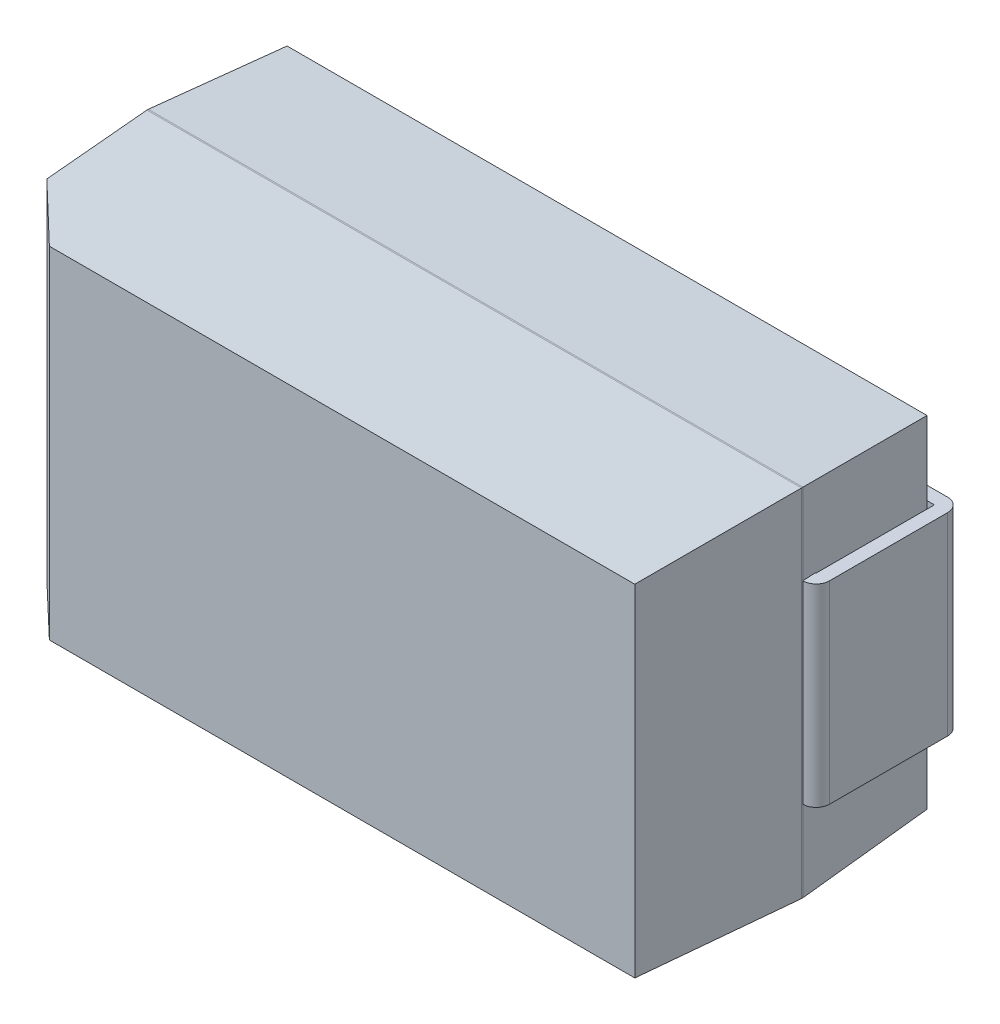
ISO-10303-21;
HEADER;
FILE_DESCRIPTION(('STEP AP214'),'2;1');
FILE_NAME('part.step','',(''),(''),'','','');
FILE_SCHEMA(('AUTOMOTIVE_DESIGN { 1 0 10303 214 1 1 1 1 }'));
ENDSEC;
DATA;
#1=APPLICATION_CONTEXT('core data for automotive mechanical design processes');
#2=APPLICATION_PROTOCOL_DEFINITION('international standard','automotive_design',2000,#1);
#3=PRODUCT_CONTEXT('',#1,'mechanical');
#4=PRODUCT('Part','Part','',(#3));
#5=PRODUCT_RELATED_PRODUCT_CATEGORY('part','',(#4));
#6=PRODUCT_DEFINITION_FORMATION('','',#4);
#7=PRODUCT_DEFINITION_CONTEXT('part definition',#1,'design');
#8=PRODUCT_DEFINITION('design','',#6,#7);
#9=PRODUCT_DEFINITION_SHAPE('','',#8);
#10=(LENGTH_UNIT() NAMED_UNIT(*) SI_UNIT(.MILLI.,.METRE.));
#11=(NAMED_UNIT(*) PLANE_ANGLE_UNIT() SI_UNIT($,.RADIAN.));
#12=(NAMED_UNIT(*) SI_UNIT($,.STERADIAN.) SOLID_ANGLE_UNIT());
#13=UNCERTAINTY_MEASURE_WITH_UNIT(LENGTH_MEASURE(1.E-05),#10,'distance_accuracy_value','');
#14=(GEOMETRIC_REPRESENTATION_CONTEXT(3) GLOBAL_UNCERTAINTY_ASSIGNED_CONTEXT((#13)) GLOBAL_UNIT_ASSIGNED_CONTEXT((#10,
#11,#12)) REPRESENTATION_CONTEXT('',''));
#15=CARTESIAN_POINT('',(0.,0.,0.));
#16=DIRECTION('',(0.,0.,1.));
#17=DIRECTION('',(1.,0.,0.));
#18=AXIS2_PLACEMENT_3D('',#15,#16,#17);
#19=CARTESIAN_POINT('',(-2.425125,-1.3325,1.69275));
#20=DIRECTION('',(0.998951225041669,0.,-0.045787006756815));
#21=DIRECTION('',(0.,1.,0.));
#22=AXIS2_PLACEMENT_3D('',#19,#20,#21);
#23=PLANE('',#22);
#24=DIRECTION('',(0.,1.,0.));
#25=VECTOR('',#24,1.);
#26=CARTESIAN_POINT('',(-2.416465439012,-1.27775,1.881678686764));
#27=LINE('',#26,#25);
#28=CARTESIAN_POINT('',(-2.416465439012,-1.296465439012,1.881678686764));
#29=VERTEX_POINT('',#28);
#30=CARTESIAN_POINT('',(-2.416465439012,1.296465439012,1.881678686764));
#31=VERTEX_POINT('',#30);
#32=EDGE_CURVE('P0_E11',#29,#31,#27,.T.);
#33=ORIENTED_EDGE('',*,*,#32,.T.);
#34=DIRECTION('',(0.045739087004806,-0.045739087004806,0.9979057429637));
#35=VECTOR('',#34,1.);
#36=CARTESIAN_POINT('',(-2.422394594868,1.302394594868,1.75232020878));
#37=LINE('',#36,#35);
#38=CARTESIAN_POINT('',(-2.4525,1.3325,1.0955));
#39=VERTEX_POINT('',#38);
#40=EDGE_CURVE('P0_E23',#39,#31,#37,.T.);
#41=ORIENTED_EDGE('',*,*,#40,.F.);
#42=DIRECTION('',(0.,1.,0.));
#43=VECTOR('',#42,1.);
#44=CARTESIAN_POINT('',(-2.4525,-1.3325,1.0955));
#45=LINE('',#44,#43);
#46=CARTESIAN_POINT('',(-2.4525,-1.3325,1.0955));
#47=VERTEX_POINT('',#46);
#48=EDGE_CURVE('P0_E170',#47,#39,#45,.T.);
#49=ORIENTED_EDGE('',*,*,#48,.F.);
#50=DIRECTION('',(0.045739087004806,0.045739087004806,0.9979057429637));
#51=VECTOR('',#50,1.);
#52=CARTESIAN_POINT('',(-2.425182270254,-1.305182270254,1.691500514728));
#53=LINE('',#52,#51);
#54=EDGE_CURVE('P0_E35',#47,#29,#53,.T.);
#55=ORIENTED_EDGE('',*,*,#54,.T.);
#56=EDGE_LOOP('',(#33,#41,#49,#55));
#57=FACE_BOUND('',#56,.T.);
#58=ADVANCED_FACE('P0_F16',(#57),#23,.F.);
#59=CARTESIAN_POINT('',(-2.4525,-1.305125,1.69275));
#60=DIRECTION('',(0.,0.998951225041669,-0.045787006756815));
#61=DIRECTION('',(-1.,0.,0.));
#62=AXIS2_PLACEMENT_3D('',#59,#60,#61);
#63=PLANE('',#62);
#64=ORIENTED_EDGE('',*,*,#54,.F.);
#65=DIRECTION('',(1.,0.,0.));
#66=VECTOR('',#65,1.);
#67=CARTESIAN_POINT('',(-2.4525,-1.3325,1.0955));
#68=LINE('',#67,#66);
#69=CARTESIAN_POINT('',(2.4525,-1.3325,1.0955));
#70=VERTEX_POINT('',#69);
#71=EDGE_CURVE('P0_E167',#47,#70,#68,.T.);
#72=ORIENTED_EDGE('',*,*,#71,.T.);
#73=DIRECTION('',(-0.045739087004806,0.045739087004806,0.9979057429637));
#74=VECTOR('',#73,1.);
#75=CARTESIAN_POINT('',(2.420051483098,-1.300051483098,1.803440702092));
#76=LINE('',#75,#74);
#77=CARTESIAN_POINT('',(2.39775,-1.27775,2.29));
#78=VERTEX_POINT('',#77);
#79=EDGE_CURVE('P0_E165',#70,#78,#76,.T.);
#80=ORIENTED_EDGE('',*,*,#79,.T.);
#81=DIRECTION('',(1.,0.,0.));
#82=VECTOR('',#81,1.);
#83=CARTESIAN_POINT('',(-2.4525,-1.27775,2.29));
#84=LINE('',#83,#82);
#85=CARTESIAN_POINT('',(-1.989,-1.27775,2.29));
#86=VERTEX_POINT('',#85);
#87=EDGE_CURVE('P0_E162',#86,#78,#84,.T.);
#88=ORIENTED_EDGE('',*,*,#87,.F.);
#89=DIRECTION('',(0.72275162794003,0.031643760591961,0.690383050723028));
#90=VECTOR('',#89,1.);
#91=CARTESIAN_POINT('',(-2.366138171404,-1.294261993256,1.929752037556));
#92=LINE('',#91,#90);
#93=EDGE_CURVE('P0_E159',#29,#86,#92,.T.);
#94=ORIENTED_EDGE('',*,*,#93,.F.);
#95=EDGE_LOOP('',(#64,#72,#80,#88,#94));
#96=FACE_BOUND('',#95,.T.);
#97=ADVANCED_FACE('P0_F206',(#96),#63,.F.);
#98=CARTESIAN_POINT('',(-2.202732719506,-1.27775,2.085839343382));
#99=DIRECTION('',(0.690728960317711,0.,-0.723113755489698));
#100=DIRECTION('',(0.,1.,0.));
#101=AXIS2_PLACEMENT_3D('',#98,#99,#100);
#102=PLANE('',#101);
#103=DIRECTION('',(0.,1.,0.));
#104=VECTOR('',#103,1.);
#105=CARTESIAN_POINT('',(-1.989,-1.27775,2.29));
#106=LINE('',#105,#104);
#107=CARTESIAN_POINT('',(-1.989,1.27775,2.29));
#108=VERTEX_POINT('',#107);
#109=EDGE_CURVE('P0_E156',#86,#108,#106,.T.);
#110=ORIENTED_EDGE('',*,*,#109,.T.);
#111=DIRECTION('',(0.72275162794003,-0.031643760591961,0.690383050723028));
#112=VECTOR('',#111,1.);
#113=CARTESIAN_POINT('',(-2.336915288471,1.292982546935,1.957666167792));
#114=LINE('',#113,#112);
#115=EDGE_CURVE('P0_E154',#31,#108,#114,.T.);
#116=ORIENTED_EDGE('',*,*,#115,.F.);
#117=ORIENTED_EDGE('',*,*,#32,.F.);
#118=ORIENTED_EDGE('',*,*,#93,.T.);
#119=EDGE_LOOP('',(#110,#116,#117,#118));
#120=FACE_BOUND('',#119,.T.);
#121=ADVANCED_FACE('P0_F210',(#120),#102,.F.);
#122=CARTESIAN_POINT('',(-2.4525,-1.3325,0.1));
#123=DIRECTION('',(1.,0.,0.));
#124=DIRECTION('',(0.,0.,1.));
#125=AXIS2_PLACEMENT_3D('',#122,#123,#124);
#126=PLANE('',#125);
#127=ORIENTED_EDGE('',*,*,#48,.T.);
#128=DIRECTION('',(0.,0.,1.));
#129=VECTOR('',#128,1.);
#130=CARTESIAN_POINT('',(-2.4525,1.3325,0.1));
#131=LINE('',#130,#129);
#132=CARTESIAN_POINT('',(-2.4525,1.3325,1.0855));
#133=VERTEX_POINT('',#132);
#134=EDGE_CURVE('P0_E151',#133,#39,#131,.T.);
#135=ORIENTED_EDGE('',*,*,#134,.F.);
#136=DIRECTION('',(0.,1.,0.));
#137=VECTOR('',#136,1.);
#138=CARTESIAN_POINT('',(-2.4525,-1.3325,1.0855));
#139=LINE('',#138,#137);
#140=CARTESIAN_POINT('',(-2.4525,-1.3325,1.0855));
#141=VERTEX_POINT('',#140);
#142=EDGE_CURVE('P0_E149',#141,#133,#139,.T.);
#143=ORIENTED_EDGE('',*,*,#142,.F.);
#144=DIRECTION('',(0.,0.,1.));
#145=VECTOR('',#144,1.);
#146=CARTESIAN_POINT('',(-2.4525,-1.3325,0.1));
#147=LINE('',#146,#145);
#148=EDGE_CURVE('P0_E146',#141,#47,#147,.T.);
#149=ORIENTED_EDGE('',*,*,#148,.T.);
#150=EDGE_LOOP('',(#127,#135,#143,#149));
#151=FACE_BOUND('',#150,.T.);
#152=ADVANCED_FACE('P0_F173',(#151),#126,.F.);
#153=CARTESIAN_POINT('',(-2.4525,1.305125,1.69275));
#154=DIRECTION('',(0.,0.998951225041669,0.045787006756815));
#155=DIRECTION('',(-1.,0.,0.));
#156=AXIS2_PLACEMENT_3D('',#153,#154,#155);
#157=PLANE('',#156);
#158=ORIENTED_EDGE('',*,*,#115,.T.);
#159=DIRECTION('',(1.,0.,0.));
#160=VECTOR('',#159,1.);
#161=CARTESIAN_POINT('',(-2.4525,1.27775,2.29));
#162=LINE('',#161,#160);
#163=CARTESIAN_POINT('',(2.39775,1.27775,2.29));
#164=VERTEX_POINT('',#163);
#165=EDGE_CURVE('P0_E143',#108,#164,#162,.T.);
#166=ORIENTED_EDGE('',*,*,#165,.T.);
#167=DIRECTION('',(-0.045739087004806,-0.045739087004806,0.9979057429637));
#168=VECTOR('',#167,1.);
#169=CARTESIAN_POINT('',(2.417263807711,1.297263807711,1.864260396144));
#170=LINE('',#169,#168);
#171=CARTESIAN_POINT('',(2.4525,1.3325,1.0955));
#172=VERTEX_POINT('',#171);
#173=EDGE_CURVE('P0_E141',#172,#164,#170,.T.);
#174=ORIENTED_EDGE('',*,*,#173,.F.);
#175=DIRECTION('',(1.,0.,0.));
#176=VECTOR('',#175,1.);
#177=CARTESIAN_POINT('',(-2.4525,1.3325,1.0955));
#178=LINE('',#177,#176);
#179=EDGE_CURVE('P0_E139',#39,#172,#178,.T.);
#180=ORIENTED_EDGE('',*,*,#179,.F.);
#181=ORIENTED_EDGE('',*,*,#40,.T.);
#182=EDGE_LOOP('',(#158,#166,#174,#180,#181));
#183=FACE_BOUND('',#182,.T.);
#184=ADVANCED_FACE('P0_F180',(#183),#157,.T.);
#185=CARTESIAN_POINT('',(-2.4525,-1.3325,0.1));
#186=DIRECTION('',(0.,1.,0.));
#187=DIRECTION('',(0.,0.,1.));
#188=AXIS2_PLACEMENT_3D('',#185,#186,#187);
#189=PLANE('',#188);
#190=ORIENTED_EDGE('',*,*,#71,.F.);
#191=ORIENTED_EDGE('',*,*,#148,.F.);
#192=DIRECTION('',(1.,0.,0.));
#193=VECTOR('',#192,1.);
#194=CARTESIAN_POINT('',(-2.4525,-1.3325,1.0855));
#195=LINE('',#194,#193);
#196=CARTESIAN_POINT('',(2.4525,-1.3325,1.0855));
#197=VERTEX_POINT('',#196);
#198=EDGE_CURVE('P0_E136',#141,#197,#195,.T.);
#199=ORIENTED_EDGE('',*,*,#198,.T.);
#200=DIRECTION('',(0.,0.,1.));
#201=VECTOR('',#200,1.);
#202=CARTESIAN_POINT('',(2.4525,-1.3325,0.1));
#203=LINE('',#202,#201);
#204=EDGE_CURVE('P0_E133',#197,#70,#203,.T.);
#205=ORIENTED_EDGE('',*,*,#204,.T.);
#206=EDGE_LOOP('',(#190,#191,#199,#205));
#207=FACE_BOUND('',#206,.T.);
#208=ADVANCED_FACE('P0_F222',(#207),#189,.F.);
#209=CARTESIAN_POINT('',(-2.4525,-1.3325,2.29));
#210=DIRECTION('',(0.,0.,1.));
#211=DIRECTION('',(1.,0.,0.));
#212=AXIS2_PLACEMENT_3D('',#209,#210,#211);
#213=PLANE('',#212);
#214=ORIENTED_EDGE('',*,*,#87,.T.);
#215=DIRECTION('',(0.,1.,0.));
#216=VECTOR('',#215,1.);
#217=CARTESIAN_POINT('',(2.39775,-1.3325,2.29));
#218=LINE('',#217,#216);
#219=EDGE_CURVE('P0_E130',#78,#164,#218,.T.);
#220=ORIENTED_EDGE('',*,*,#219,.T.);
#221=ORIENTED_EDGE('',*,*,#165,.F.);
#222=ORIENTED_EDGE('',*,*,#109,.F.);
#223=EDGE_LOOP('',(#214,#220,#221,#222));
#224=FACE_BOUND('',#223,.T.);
#225=ADVANCED_FACE('P0_F203',(#224),#213,.T.);
#226=CARTESIAN_POINT('',(2.425125,-1.3325,1.69275));
#227=DIRECTION('',(0.998951225041669,0.,0.045787006756815));
#228=DIRECTION('',(0.,1.,0.));
#229=AXIS2_PLACEMENT_3D('',#226,#227,#228);
#230=PLANE('',#229);
#231=ORIENTED_EDGE('',*,*,#79,.F.);
#232=DIRECTION('',(0.,1.,0.));
#233=VECTOR('',#232,1.);
#234=CARTESIAN_POINT('',(2.4525,-1.3325,1.0955));
#235=LINE('',#234,#233);
#236=EDGE_CURVE('P0_E127',#70,#172,#235,.T.);
#237=ORIENTED_EDGE('',*,*,#236,.T.);
#238=ORIENTED_EDGE('',*,*,#173,.T.);
#239=ORIENTED_EDGE('',*,*,#219,.F.);
#240=EDGE_LOOP('',(#231,#237,#238,#239));
#241=FACE_BOUND('',#240,.T.);
#242=ADVANCED_FACE('P0_F186',(#241),#230,.T.);
#243=CARTESIAN_POINT('',(-2.425125,-1.3325,0.59275));
#244=DIRECTION('',(-0.998460353205411,0.,-0.055470019622543));
#245=DIRECTION('',(0.,1.,0.));
#246=AXIS2_PLACEMENT_3D('',#243,#244,#245);
#247=PLANE('',#246);
#248=DIRECTION('',(0.055384877562174,0.055384877562174,-0.99692779611908));
#249=VECTOR('',#248,1.);
#250=CARTESIAN_POINT('',(-2.425208972393,-1.305208972393,0.594261503067));
#251=LINE('',#250,#249);
#252=CARTESIAN_POINT('',(-2.39775,-1.27775,0.1));
#253=VERTEX_POINT('',#252);
#254=EDGE_CURVE('P0_E125',#141,#253,#251,.T.);
#255=ORIENTED_EDGE('',*,*,#254,.F.);
#256=ORIENTED_EDGE('',*,*,#142,.T.);
#257=DIRECTION('',(0.055384877562174,-0.055384877562174,-0.99692779611908));
#258=VECTOR('',#257,1.);
#259=CARTESIAN_POINT('',(-2.42112154908,1.30112154908,0.520687883436));
#260=LINE('',#259,#258);
#261=CARTESIAN_POINT('',(-2.39775,1.27775,0.1));
#262=VERTEX_POINT('',#261);
#263=EDGE_CURVE('P0_E123',#133,#262,#260,.T.);
#264=ORIENTED_EDGE('',*,*,#263,.T.);
#265=DIRECTION('',(0.,1.,0.));
#266=VECTOR('',#265,1.);
#267=CARTESIAN_POINT('',(-2.39775,-1.3325,0.1));
#268=LINE('',#267,#266);
#269=EDGE_CURVE('P0_E102',#253,#262,#268,.T.);
#270=ORIENTED_EDGE('',*,*,#269,.F.);
#271=EDGE_LOOP('',(#255,#256,#264,#270));
#272=FACE_BOUND('',#271,.T.);
#273=ADVANCED_FACE('P0_F194',(#272),#247,.T.);
#274=CARTESIAN_POINT('',(-2.4525,1.3325,0.1));
#275=DIRECTION('',(0.,1.,0.));
#276=DIRECTION('',(0.,0.,1.));
#277=AXIS2_PLACEMENT_3D('',#274,#275,#276);
#278=PLANE('',#277);
#279=DIRECTION('',(0.,0.,1.));
#280=VECTOR('',#279,1.);
#281=CARTESIAN_POINT('',(2.4525,1.3325,0.1));
#282=LINE('',#281,#280);
#283=CARTESIAN_POINT('',(2.4525,1.3325,1.0855));
#284=VERTEX_POINT('',#283);
#285=EDGE_CURVE('P0_E119',#284,#172,#282,.T.);
#286=ORIENTED_EDGE('',*,*,#285,.F.);
#287=DIRECTION('',(1.,0.,0.));
#288=VECTOR('',#287,1.);
#289=CARTESIAN_POINT('',(-2.4525,1.3325,1.0855));
#290=LINE('',#289,#288);
#291=EDGE_CURVE('P0_E109',#133,#284,#290,.T.);
#292=ORIENTED_EDGE('',*,*,#291,.F.);
#293=ORIENTED_EDGE('',*,*,#134,.T.);
#294=ORIENTED_EDGE('',*,*,#179,.T.);
#295=EDGE_LOOP('',(#286,#292,#293,#294));
#296=FACE_BOUND('',#295,.T.);
#297=ADVANCED_FACE('P0_F178',(#296),#278,.T.);
#298=CARTESIAN_POINT('',(2.4525,-1.3325,0.1));
#299=DIRECTION('',(1.,0.,0.));
#300=DIRECTION('',(0.,0.,1.));
#301=AXIS2_PLACEMENT_3D('',#298,#299,#300);
#302=PLANE('',#301);
#303=ORIENTED_EDGE('',*,*,#204,.F.);
#304=DIRECTION('',(0.,1.,0.));
#305=VECTOR('',#304,1.);
#306=CARTESIAN_POINT('',(2.4525,-1.3325,1.0855));
#307=LINE('',#306,#305);
#308=EDGE_CURVE('P0_E116',#197,#284,#307,.T.);
#309=ORIENTED_EDGE('',*,*,#308,.T.);
#310=ORIENTED_EDGE('',*,*,#285,.T.);
#311=ORIENTED_EDGE('',*,*,#236,.F.);
#312=EDGE_LOOP('',(#303,#309,#310,#311));
#313=FACE_BOUND('',#312,.T.);
#314=ADVANCED_FACE('P0_F188',(#313),#302,.T.);
#315=CARTESIAN_POINT('',(-2.4525,-1.305125,0.59275));
#316=DIRECTION('',(0.,-0.998460353205411,-0.055470019622543));
#317=DIRECTION('',(-1.,0.,0.));
#318=AXIS2_PLACEMENT_3D('',#315,#316,#317);
#319=PLANE('',#318);
#320=DIRECTION('',(1.,0.,0.));
#321=VECTOR('',#320,1.);
#322=CARTESIAN_POINT('',(-2.4525,-1.27775,0.1));
#323=LINE('',#322,#321);
#324=CARTESIAN_POINT('',(2.39775,-1.27775,0.1));
#325=VERTEX_POINT('',#324);
#326=EDGE_CURVE('P0_E114',#253,#325,#323,.T.);
#327=ORIENTED_EDGE('',*,*,#326,.T.);
#328=DIRECTION('',(-0.055384877562174,0.055384877562174,-0.99692779611908));
#329=VECTOR('',#328,1.);
#330=CARTESIAN_POINT('',(2.417685966258,-1.297685966258,0.458847392638));
#331=LINE('',#330,#329);
#332=EDGE_CURVE('P0_E92',#197,#325,#331,.T.);
#333=ORIENTED_EDGE('',*,*,#332,.F.);
#334=ORIENTED_EDGE('',*,*,#198,.F.);
#335=ORIENTED_EDGE('',*,*,#254,.T.);
#336=EDGE_LOOP('',(#327,#333,#334,#335));
#337=FACE_BOUND('',#336,.T.);
#338=ADVANCED_FACE('P0_F191',(#337),#319,.T.);
#339=CARTESIAN_POINT('',(-2.4525,-1.3325,0.1));
#340=DIRECTION('',(0.,0.,1.));
#341=DIRECTION('',(1.,0.,0.));
#342=AXIS2_PLACEMENT_3D('',#339,#340,#341);
#343=PLANE('',#342);
#344=DIRECTION('',(1.,0.,0.));
#345=VECTOR('',#344,1.);
#346=CARTESIAN_POINT('',(-2.4525,1.27775,0.1));
#347=LINE('',#346,#345);
#348=CARTESIAN_POINT('',(2.39775,1.27775,0.1));
#349=VERTEX_POINT('',#348);
#350=EDGE_CURVE('P0_E96',#262,#349,#347,.T.);
#351=ORIENTED_EDGE('',*,*,#350,.T.);
#352=DIRECTION('',(0.,1.,0.));
#353=VECTOR('',#352,1.);
#354=CARTESIAN_POINT('',(2.39775,-1.3325,0.1));
#355=LINE('',#354,#353);
#356=EDGE_CURVE('P0_E85',#325,#349,#355,.T.);
#357=ORIENTED_EDGE('',*,*,#356,.F.);
#358=ORIENTED_EDGE('',*,*,#326,.F.);
#359=ORIENTED_EDGE('',*,*,#269,.T.);
#360=EDGE_LOOP('',(#351,#357,#358,#359));
#361=FACE_BOUND('',#360,.T.);
#362=ADVANCED_FACE('P0_F100',(#361),#343,.F.);
#363=CARTESIAN_POINT('',(-2.4525,1.305125,0.59275));
#364=DIRECTION('',(0.,-0.998460353205411,0.055470019622543));
#365=DIRECTION('',(-1.,0.,0.));
#366=AXIS2_PLACEMENT_3D('',#363,#364,#365);
#367=PLANE('',#366);
#368=ORIENTED_EDGE('',*,*,#263,.F.);
#369=ORIENTED_EDGE('',*,*,#291,.T.);
#370=DIRECTION('',(-0.055384877562174,-0.055384877562174,-0.99692779611908));
#371=VECTOR('',#370,1.);
#372=CARTESIAN_POINT('',(2.413598542945,1.293598542945,0.385273773006));
#373=LINE('',#372,#371);
#374=EDGE_CURVE('P0_E90',#284,#349,#373,.T.);
#375=ORIENTED_EDGE('',*,*,#374,.T.);
#376=ORIENTED_EDGE('',*,*,#350,.F.);
#377=EDGE_LOOP('',(#368,#369,#375,#376));
#378=FACE_BOUND('',#377,.T.);
#379=ADVANCED_FACE('P0_F107',(#378),#367,.F.);
#380=CARTESIAN_POINT('',(2.425125,-1.3325,0.59275));
#381=DIRECTION('',(-0.998460353205411,0.,0.055470019622543));
#382=DIRECTION('',(0.,1.,0.));
#383=AXIS2_PLACEMENT_3D('',#380,#381,#382);
#384=PLANE('',#383);
#385=ORIENTED_EDGE('',*,*,#356,.T.);
#386=ORIENTED_EDGE('',*,*,#374,.F.);
#387=ORIENTED_EDGE('',*,*,#308,.F.);
#388=ORIENTED_EDGE('',*,*,#332,.T.);
#389=EDGE_LOOP('',(#385,#386,#387,#388));
#390=FACE_BOUND('',#389,.T.);
#391=ADVANCED_FACE('P0_F87',(#390),#384,.F.);
#392=CLOSED_SHELL('',(#58,#97,#121,#152,#184,#208,#225,#242,#273,#297,#314,#338,#362,#379,#391));
#393=MANIFOLD_SOLID_BREP('P0_B1',#392);
#394=CARTESIAN_POINT('',(-2.129541541621,-0.724999999999999,0.527183738746));
#395=DIRECTION('',(0.,-1.,0.));
#396=DIRECTION('',(0.,0.,-1.));
#397=AXIS2_PLACEMENT_3D('',#394,#395,#396);
#398=PLANE('',#397);
#399=DIRECTION('',(1.,0.,0.));
#400=VECTOR('',#399,1.);
#401=CARTESIAN_POINT('',(-2.5525,-0.724999999999999,1.0855));
#402=LINE('',#401,#400);
#403=CARTESIAN_POINT('',(-2.4525,-0.724999999999999,1.0855));
#404=VERTEX_POINT('',#403);
#405=CARTESIAN_POINT('',(-1.5125,-0.725,1.0855));
#406=VERTEX_POINT('',#405);
#407=EDGE_CURVE('P1_E11',#404,#406,#402,.T.);
#408=ORIENTED_EDGE('',*,*,#407,.F.);
#409=CARTESIAN_POINT('',(-2.4525,-0.724999999999999,0.9855));
#410=DIRECTION('',(0.,-1.,0.));
#411=DIRECTION('',(0.,0.,1.));
#412=AXIS2_PLACEMENT_3D('',#409,#410,#411);
#413=CIRCLE('',#412,0.1);
#414=CARTESIAN_POINT('',(-2.5525,-0.724999999999999,0.9855));
#415=VERTEX_POINT('',#414);
#416=EDGE_CURVE('P1_E23',#404,#415,#413,.T.);
#417=ORIENTED_EDGE('',*,*,#416,.T.);
#418=DIRECTION('',(0.,0.,1.));
#419=VECTOR('',#418,1.);
#420=CARTESIAN_POINT('',(-2.5525,-0.724999999999999,0.));
#421=LINE('',#420,#419);
#422=CARTESIAN_POINT('',(-2.5525,-0.724999999999999,0.1));
#423=VERTEX_POINT('',#422);
#424=EDGE_CURVE('P1_E167',#423,#415,#421,.T.);
#425=ORIENTED_EDGE('',*,*,#424,.F.);
#426=CARTESIAN_POINT('',(-2.4525,-0.724999999999999,0.1));
#427=DIRECTION('',(0.,-1.,0.));
#428=DIRECTION('',(0.,0.,1.));
#429=AXIS2_PLACEMENT_3D('',#426,#427,#428);
#430=CIRCLE('',#429,0.1);
#431=CARTESIAN_POINT('',(-2.4525,-0.724999999999999,0.));
#432=VERTEX_POINT('',#431);
#433=EDGE_CURVE('P1_E165',#423,#432,#430,.T.);
#434=ORIENTED_EDGE('',*,*,#433,.T.);
#435=DIRECTION('',(1.,0.,0.));
#436=VECTOR('',#435,1.);
#437=CARTESIAN_POINT('',(-2.5525,-0.724999999999999,0.));
#438=LINE('',#437,#436);
#439=CARTESIAN_POINT('',(-1.4125,-0.725,0.));
#440=VERTEX_POINT('',#439);
#441=EDGE_CURVE('P1_E163',#432,#440,#438,.T.);
#442=ORIENTED_EDGE('',*,*,#441,.T.);
#443=DIRECTION('',(0.,0.,1.));
#444=VECTOR('',#443,1.);
#445=CARTESIAN_POINT('',(-1.4125,-0.725,0.));
#446=LINE('',#445,#444);
#447=CARTESIAN_POINT('',(-1.4125,-0.725,0.1));
#448=VERTEX_POINT('',#447);
#449=EDGE_CURVE('P1_E161',#440,#448,#446,.T.);
#450=ORIENTED_EDGE('',*,*,#449,.T.);
#451=DIRECTION('',(1.,0.,0.));
#452=VECTOR('',#451,1.);
#453=CARTESIAN_POINT('',(-2.5525,-0.724999999999999,0.1));
#454=LINE('',#453,#452);
#455=CARTESIAN_POINT('',(-2.4525,-0.724999999999999,0.1));
#456=VERTEX_POINT('',#455);
#457=EDGE_CURVE('P1_E106',#456,#448,#454,.T.);
#458=ORIENTED_EDGE('',*,*,#457,.F.);
#459=DIRECTION('',(0.,0.,1.));
#460=VECTOR('',#459,1.);
#461=CARTESIAN_POINT('',(-2.4525,-0.724999999999999,0.));
#462=LINE('',#461,#460);
#463=CARTESIAN_POINT('',(-2.4525,-0.724999999999999,0.9855));
#464=VERTEX_POINT('',#463);
#465=EDGE_CURVE('P1_E158',#456,#464,#462,.T.);
#466=ORIENTED_EDGE('',*,*,#465,.T.);
#467=DIRECTION('',(1.,0.,0.));
#468=VECTOR('',#467,1.);
#469=CARTESIAN_POINT('',(-2.5525,-0.724999999999999,0.9855));
#470=LINE('',#469,#468);
#471=CARTESIAN_POINT('',(-1.5125,-0.725,0.9855));
#472=VERTEX_POINT('',#471);
#473=EDGE_CURVE('P1_E156',#464,#472,#470,.T.);
#474=ORIENTED_EDGE('',*,*,#473,.T.);
#475=DIRECTION('',(0.,0.,1.));
#476=VECTOR('',#475,1.);
#477=CARTESIAN_POINT('',(-1.5125,-0.725,0.9855));
#478=LINE('',#477,#476);
#479=EDGE_CURVE('P1_E154',#472,#406,#478,.T.);
#480=ORIENTED_EDGE('',*,*,#479,.T.);
#481=EDGE_LOOP('',(#408,#417,#425,#434,#442,#450,#458,#466,#474,#480));
#482=FACE_BOUND('',#481,.T.);
#483=ADVANCED_FACE('P1_F16',(#482),#398,.T.);
#484=CARTESIAN_POINT('',(-2.5525,-0.724999999999999,1.0855));
#485=DIRECTION('',(0.,0.,1.));
#486=DIRECTION('',(1.,0.,0.));
#487=AXIS2_PLACEMENT_3D('',#484,#485,#486);
#488=PLANE('',#487);
#489=DIRECTION('',(1.,0.,0.));
#490=VECTOR('',#489,1.);
#491=CARTESIAN_POINT('',(-2.5525,0.725000000000001,1.0855));
#492=LINE('',#491,#490);
#493=CARTESIAN_POINT('',(-2.4525,0.725000000000001,1.0855));
#494=VERTEX_POINT('',#493);
#495=CARTESIAN_POINT('',(-1.5125,0.725,1.0855));
#496=VERTEX_POINT('',#495);
#497=EDGE_CURVE('P1_E152',#494,#496,#492,.T.);
#498=ORIENTED_EDGE('',*,*,#497,.F.);
#499=DIRECTION('',(0.,1.,0.));
#500=VECTOR('',#499,1.);
#501=CARTESIAN_POINT('',(-2.4525,-0.724999999999999,1.0855));
#502=LINE('',#501,#500);
#503=EDGE_CURVE('P1_E149',#404,#494,#502,.T.);
#504=ORIENTED_EDGE('',*,*,#503,.F.);
#505=ORIENTED_EDGE('',*,*,#407,.T.);
#506=DIRECTION('',(0.,1.,0.));
#507=VECTOR('',#506,1.);
#508=CARTESIAN_POINT('',(-1.5125,-0.725,1.0855));
#509=LINE('',#508,#507);
#510=EDGE_CURVE('P1_E147',#406,#496,#509,.T.);
#511=ORIENTED_EDGE('',*,*,#510,.T.);
#512=EDGE_LOOP('',(#498,#504,#505,#511));
#513=FACE_BOUND('',#512,.T.);
#514=ADVANCED_FACE('P1_F198',(#513),#488,.T.);
#515=CARTESIAN_POINT('',(-2.4525,-0.724999999999999,0.9855));
#516=DIRECTION('',(0.,1.,0.));
#517=DIRECTION('',(0.,0.,1.));
#518=AXIS2_PLACEMENT_3D('',#515,#516,#517);
#519=CYLINDRICAL_SURFACE('',#518,0.1);
#520=ORIENTED_EDGE('',*,*,#503,.T.);
#521=CARTESIAN_POINT('',(-2.4525,0.725000000000001,0.9855));
#522=DIRECTION('',(0.,-1.,0.));
#523=DIRECTION('',(0.,0.,1.));
#524=AXIS2_PLACEMENT_3D('',#521,#522,#523);
#525=CIRCLE('',#524,0.1);
#526=CARTESIAN_POINT('',(-2.5525,0.725000000000001,0.9855));
#527=VERTEX_POINT('',#526);
#528=EDGE_CURVE('P1_E145',#494,#527,#525,.T.);
#529=ORIENTED_EDGE('',*,*,#528,.T.);
#530=DIRECTION('',(0.,1.,0.));
#531=VECTOR('',#530,1.);
#532=CARTESIAN_POINT('',(-2.5525,-0.724999999999999,0.9855));
#533=LINE('',#532,#531);
#534=EDGE_CURVE('P1_E142',#415,#527,#533,.T.);
#535=ORIENTED_EDGE('',*,*,#534,.F.);
#536=ORIENTED_EDGE('',*,*,#416,.F.);
#537=EDGE_LOOP('',(#520,#529,#535,#536));
#538=FACE_BOUND('',#537,.T.);
#539=ADVANCED_FACE('P1_F176',(#538),#519,.T.);
#540=CARTESIAN_POINT('',(-1.5125,-0.725,0.9855));
#541=DIRECTION('',(1.,0.,0.));
#542=DIRECTION('',(0.,0.,1.));
#543=AXIS2_PLACEMENT_3D('',#540,#541,#542);
#544=PLANE('',#543);
#545=ORIENTED_EDGE('',*,*,#479,.F.);
#546=DIRECTION('',(0.,1.,0.));
#547=VECTOR('',#546,1.);
#548=CARTESIAN_POINT('',(-1.5125,-0.725,0.9855));
#549=LINE('',#548,#547);
#550=CARTESIAN_POINT('',(-1.5125,0.725,0.9855));
#551=VERTEX_POINT('',#550);
#552=EDGE_CURVE('P1_E140',#472,#551,#549,.T.);
#553=ORIENTED_EDGE('',*,*,#552,.T.);
#554=DIRECTION('',(0.,0.,1.));
#555=VECTOR('',#554,1.);
#556=CARTESIAN_POINT('',(-1.5125,0.725,0.9855));
#557=LINE('',#556,#555);
#558=EDGE_CURVE('P1_E137',#551,#496,#557,.T.);
#559=ORIENTED_EDGE('',*,*,#558,.T.);
#560=ORIENTED_EDGE('',*,*,#510,.F.);
#561=EDGE_LOOP('',(#545,#553,#559,#560));
#562=FACE_BOUND('',#561,.T.);
#563=ADVANCED_FACE('P1_F197',(#562),#544,.T.);
#564=CARTESIAN_POINT('',(-2.5525,-0.724999999999999,0.));
#565=DIRECTION('',(1.,0.,0.));
#566=DIRECTION('',(0.,0.,1.));
#567=AXIS2_PLACEMENT_3D('',#564,#565,#566);
#568=PLANE('',#567);
#569=ORIENTED_EDGE('',*,*,#534,.T.);
#570=DIRECTION('',(0.,0.,1.));
#571=VECTOR('',#570,1.);
#572=CARTESIAN_POINT('',(-2.5525,0.725000000000001,0.));
#573=LINE('',#572,#571);
#574=CARTESIAN_POINT('',(-2.5525,0.725000000000001,0.1));
#575=VERTEX_POINT('',#574);
#576=EDGE_CURVE('P1_E134',#575,#527,#573,.T.);
#577=ORIENTED_EDGE('',*,*,#576,.F.);
#578=DIRECTION('',(0.,1.,0.));
#579=VECTOR('',#578,1.);
#580=CARTESIAN_POINT('',(-2.5525,-0.724999999999999,0.1));
#581=LINE('',#580,#579);
#582=EDGE_CURVE('P1_E132',#423,#575,#581,.T.);
#583=ORIENTED_EDGE('',*,*,#582,.F.);
#584=ORIENTED_EDGE('',*,*,#424,.T.);
#585=EDGE_LOOP('',(#569,#577,#583,#584));
#586=FACE_BOUND('',#585,.T.);
#587=ADVANCED_FACE('P1_F174',(#586),#568,.F.);
#588=CARTESIAN_POINT('',(-2.5525,-0.724999999999999,0.9855));
#589=DIRECTION('',(0.,0.,1.));
#590=DIRECTION('',(1.,0.,0.));
#591=AXIS2_PLACEMENT_3D('',#588,#589,#590);
#592=PLANE('',#591);
#593=ORIENTED_EDGE('',*,*,#552,.F.);
#594=ORIENTED_EDGE('',*,*,#473,.F.);
#595=DIRECTION('',(0.,1.,0.));
#596=VECTOR('',#595,1.);
#597=CARTESIAN_POINT('',(-2.4525,-0.724999999999999,0.9855));
#598=LINE('',#597,#596);
#599=CARTESIAN_POINT('',(-2.4525,0.725000000000001,0.9855));
#600=VERTEX_POINT('',#599);
#601=EDGE_CURVE('P1_E129',#464,#600,#598,.T.);
#602=ORIENTED_EDGE('',*,*,#601,.T.);
#603=DIRECTION('',(1.,0.,0.));
#604=VECTOR('',#603,1.);
#605=CARTESIAN_POINT('',(-2.5525,0.725000000000001,0.9855));
#606=LINE('',#605,#604);
#607=EDGE_CURVE('P1_E126',#600,#551,#606,.T.);
#608=ORIENTED_EDGE('',*,*,#607,.T.);
#609=EDGE_LOOP('',(#593,#594,#602,#608));
#610=FACE_BOUND('',#609,.T.);
#611=ADVANCED_FACE('P1_F193',(#610),#592,.F.);
#612=CARTESIAN_POINT('',(-2.4525,-0.724999999999999,0.1));
#613=DIRECTION('',(0.,1.,0.));
#614=DIRECTION('',(-1.,0.,0.));
#615=AXIS2_PLACEMENT_3D('',#612,#613,#614);
#616=CYLINDRICAL_SURFACE('',#615,0.1);
#617=ORIENTED_EDGE('',*,*,#582,.T.);
#618=CARTESIAN_POINT('',(-2.4525,0.725000000000001,0.1));
#619=DIRECTION('',(0.,-1.,0.));
#620=DIRECTION('',(0.,0.,1.));
#621=AXIS2_PLACEMENT_3D('',#618,#619,#620);
#622=CIRCLE('',#621,0.1);
#623=CARTESIAN_POINT('',(-2.4525,0.725000000000001,0.));
#624=VERTEX_POINT('',#623);
#625=EDGE_CURVE('P1_E124',#575,#624,#622,.T.);
#626=ORIENTED_EDGE('',*,*,#625,.T.);
#627=DIRECTION('',(0.,1.,0.));
#628=VECTOR('',#627,1.);
#629=CARTESIAN_POINT('',(-2.4525,-0.724999999999999,0.));
#630=LINE('',#629,#628);
#631=EDGE_CURVE('P1_E121',#432,#624,#630,.T.);
#632=ORIENTED_EDGE('',*,*,#631,.F.);
#633=ORIENTED_EDGE('',*,*,#433,.F.);
#634=EDGE_LOOP('',(#617,#626,#632,#633));
#635=FACE_BOUND('',#634,.T.);
#636=ADVANCED_FACE('P1_F182',(#635),#616,.T.);
#637=CARTESIAN_POINT('',(-2.4525,-0.724999999999999,0.));
#638=DIRECTION('',(1.,0.,0.));
#639=DIRECTION('',(0.,0.,1.));
#640=AXIS2_PLACEMENT_3D('',#637,#638,#639);
#641=PLANE('',#640);
#642=ORIENTED_EDGE('',*,*,#465,.F.);
#643=DIRECTION('',(0.,-1.,0.));
#644=VECTOR('',#643,1.);
#645=CARTESIAN_POINT('',(-2.4525,-0.724999999999999,0.1));
#646=LINE('',#645,#644);
#647=CARTESIAN_POINT('',(-2.4525,0.725000000000001,0.1));
#648=VERTEX_POINT('',#647);
#649=EDGE_CURVE('P1_E119',#648,#456,#646,.T.);
#650=ORIENTED_EDGE('',*,*,#649,.F.);
#651=DIRECTION('',(0.,0.,1.));
#652=VECTOR('',#651,1.);
#653=CARTESIAN_POINT('',(-2.4525,0.725000000000001,0.));
#654=LINE('',#653,#652);
#655=EDGE_CURVE('P1_E97',#648,#600,#654,.T.);
#656=ORIENTED_EDGE('',*,*,#655,.T.);
#657=ORIENTED_EDGE('',*,*,#601,.F.);
#658=EDGE_LOOP('',(#642,#650,#656,#657));
#659=FACE_BOUND('',#658,.T.);
#660=ADVANCED_FACE('P1_F190',(#659),#641,.T.);
#661=CARTESIAN_POINT('',(-2.5525,-0.724999999999999,0.));
#662=DIRECTION('',(0.,0.,1.));
#663=DIRECTION('',(1.,0.,0.));
#664=AXIS2_PLACEMENT_3D('',#661,#662,#663);
#665=PLANE('',#664);
#666=DIRECTION('',(0.,1.,0.));
#667=VECTOR('',#666,1.);
#668=CARTESIAN_POINT('',(-1.4125,-0.725,0.));
#669=LINE('',#668,#667);
#670=CARTESIAN_POINT('',(-1.4125,0.725,0.));
#671=VERTEX_POINT('',#670);
#672=EDGE_CURVE('P1_E113',#440,#671,#669,.T.);
#673=ORIENTED_EDGE('',*,*,#672,.F.);
#674=ORIENTED_EDGE('',*,*,#441,.F.);
#675=ORIENTED_EDGE('',*,*,#631,.T.);
#676=DIRECTION('',(1.,0.,0.));
#677=VECTOR('',#676,1.);
#678=CARTESIAN_POINT('',(-2.5525,0.725000000000001,0.));
#679=LINE('',#678,#677);
#680=EDGE_CURVE('P1_E100',#624,#671,#679,.T.);
#681=ORIENTED_EDGE('',*,*,#680,.T.);
#682=EDGE_LOOP('',(#673,#674,#675,#681));
#683=FACE_BOUND('',#682,.T.);
#684=ADVANCED_FACE('P1_F185',(#683),#665,.F.);
#685=CARTESIAN_POINT('',(-2.5525,-0.724999999999999,0.1));
#686=DIRECTION('',(0.,0.,1.));
#687=DIRECTION('',(1.,0.,0.));
#688=AXIS2_PLACEMENT_3D('',#685,#686,#687);
#689=PLANE('',#688);
#690=DIRECTION('',(1.,0.,0.));
#691=VECTOR('',#690,1.);
#692=CARTESIAN_POINT('',(-2.5525,0.725000000000001,0.1));
#693=LINE('',#692,#691);
#694=CARTESIAN_POINT('',(-1.4125,0.725,0.1));
#695=VERTEX_POINT('',#694);
#696=EDGE_CURVE('P1_E90',#648,#695,#693,.T.);
#697=ORIENTED_EDGE('',*,*,#696,.F.);
#698=ORIENTED_EDGE('',*,*,#649,.T.);
#699=ORIENTED_EDGE('',*,*,#457,.T.);
#700=DIRECTION('',(0.,1.,0.));
#701=VECTOR('',#700,1.);
#702=CARTESIAN_POINT('',(-1.4125,-0.725,0.1));
#703=LINE('',#702,#701);
#704=EDGE_CURVE('P1_E101',#448,#695,#703,.T.);
#705=ORIENTED_EDGE('',*,*,#704,.T.);
#706=EDGE_LOOP('',(#697,#698,#699,#705));
#707=FACE_BOUND('',#706,.T.);
#708=ADVANCED_FACE('P1_F105',(#707),#689,.T.);
#709=CARTESIAN_POINT('',(-1.4125,-0.725,0.));
#710=DIRECTION('',(1.,0.,0.));
#711=DIRECTION('',(0.,0.,1.));
#712=AXIS2_PLACEMENT_3D('',#709,#710,#711);
#713=PLANE('',#712);
#714=ORIENTED_EDGE('',*,*,#449,.F.);
#715=ORIENTED_EDGE('',*,*,#672,.T.);
#716=DIRECTION('',(0.,0.,1.));
#717=VECTOR('',#716,1.);
#718=CARTESIAN_POINT('',(-1.4125,0.725,0.));
#719=LINE('',#718,#717);
#720=EDGE_CURVE('P1_E95',#671,#695,#719,.T.);
#721=ORIENTED_EDGE('',*,*,#720,.T.);
#722=ORIENTED_EDGE('',*,*,#704,.F.);
#723=EDGE_LOOP('',(#714,#715,#721,#722));
#724=FACE_BOUND('',#723,.T.);
#725=ADVANCED_FACE('P1_F111',(#724),#713,.T.);
#726=CARTESIAN_POINT('',(-2.129541541621,0.725000000000001,0.527183738746));
#727=DIRECTION('',(0.,1.,0.));
#728=DIRECTION('',(0.,0.,1.));
#729=AXIS2_PLACEMENT_3D('',#726,#727,#728);
#730=PLANE('',#729);
#731=ORIENTED_EDGE('',*,*,#680,.F.);
#732=ORIENTED_EDGE('',*,*,#625,.F.);
#733=ORIENTED_EDGE('',*,*,#576,.T.);
#734=ORIENTED_EDGE('',*,*,#528,.F.);
#735=ORIENTED_EDGE('',*,*,#497,.T.);
#736=ORIENTED_EDGE('',*,*,#558,.F.);
#737=ORIENTED_EDGE('',*,*,#607,.F.);
#738=ORIENTED_EDGE('',*,*,#655,.F.);
#739=ORIENTED_EDGE('',*,*,#696,.T.);
#740=ORIENTED_EDGE('',*,*,#720,.F.);
#741=EDGE_LOOP('',(#731,#732,#733,#734,#735,#736,#737,#738,#739,#740));
#742=FACE_BOUND('',#741,.T.);
#743=ADVANCED_FACE('P1_F93',(#742),#730,.T.);
#744=CLOSED_SHELL('',(#483,#514,#539,#563,#587,#611,#636,#660,#684,#708,#725,#743));
#745=MANIFOLD_SOLID_BREP('P1_B1',#744);
#746=CARTESIAN_POINT('',(2.083958921408,-0.725000000000001,0.528108787699));
#747=DIRECTION('',(0.,-1.,0.));
#748=DIRECTION('',(0.,0.,-1.));
#749=AXIS2_PLACEMENT_3D('',#746,#747,#748);
#750=PLANE('',#749);
#751=DIRECTION('',(1.,0.,0.));
#752=VECTOR('',#751,1.);
#753=CARTESIAN_POINT('',(1.3125,-0.725,0.));
#754=LINE('',#753,#752);
#755=CARTESIAN_POINT('',(1.3125,-0.725,0.));
#756=VERTEX_POINT('',#755);
#757=CARTESIAN_POINT('',(2.4525,-0.725000000000001,0.));
#758=VERTEX_POINT('',#757);
#759=EDGE_CURVE('P2_E11',#756,#758,#754,.T.);
#760=ORIENTED_EDGE('',*,*,#759,.T.);
#761=CARTESIAN_POINT('',(2.4525,-0.725000000000001,0.1));
#762=DIRECTION('',(0.,1.,0.));
#763=DIRECTION('',(0.,0.,1.));
#764=AXIS2_PLACEMENT_3D('',#761,#762,#763);
#765=CIRCLE('',#764,0.1);
#766=CARTESIAN_POINT('',(2.5525,-0.725000000000001,0.1));
#767=VERTEX_POINT('',#766);
#768=EDGE_CURVE('P2_E23',#767,#758,#765,.T.);
#769=ORIENTED_EDGE('',*,*,#768,.F.);
#770=DIRECTION('',(0.,0.,1.));
#771=VECTOR('',#770,1.);
#772=CARTESIAN_POINT('',(2.5525,-0.725000000000001,0.));
#773=LINE('',#772,#771);
#774=CARTESIAN_POINT('',(2.5525,-0.725000000000001,0.9855));
#775=VERTEX_POINT('',#774);
#776=EDGE_CURVE('P2_E171',#767,#775,#773,.T.);
#777=ORIENTED_EDGE('',*,*,#776,.T.);
#778=CARTESIAN_POINT('',(2.4525,-0.725000000000001,0.9855));
#779=DIRECTION('',(0.,-1.,0.));
#780=DIRECTION('',(0.,0.,1.));
#781=AXIS2_PLACEMENT_3D('',#778,#779,#780);
#782=CIRCLE('',#781,0.1);
#783=CARTESIAN_POINT('',(2.4525,-0.725000000000001,1.0855));
#784=VERTEX_POINT('',#783);
#785=EDGE_CURVE('P2_E169',#775,#784,#782,.T.);
#786=ORIENTED_EDGE('',*,*,#785,.T.);
#787=DIRECTION('',(1.,0.,0.));
#788=VECTOR('',#787,1.);
#789=CARTESIAN_POINT('',(2.4525,-0.725000000000001,1.0855));
#790=LINE('',#789,#788);
#791=CARTESIAN_POINT('',(1.4125,-0.725,1.0855));
#792=VERTEX_POINT('',#791);
#793=EDGE_CURVE('P2_E166',#792,#784,#790,.T.);
#794=ORIENTED_EDGE('',*,*,#793,.F.);
#795=DIRECTION('',(0.,0.,1.));
#796=VECTOR('',#795,1.);
#797=CARTESIAN_POINT('',(1.4125,-0.725,0.9855));
#798=LINE('',#797,#796);
#799=CARTESIAN_POINT('',(1.4125,-0.725,0.9855));
#800=VERTEX_POINT('',#799);
#801=EDGE_CURVE('P2_E164',#800,#792,#798,.T.);
#802=ORIENTED_EDGE('',*,*,#801,.F.);
#803=DIRECTION('',(1.,0.,0.));
#804=VECTOR('',#803,1.);
#805=CARTESIAN_POINT('',(1.4125,-0.725,0.9855));
#806=LINE('',#805,#804);
#807=CARTESIAN_POINT('',(2.4525,-0.725000000000001,0.9855));
#808=VERTEX_POINT('',#807);
#809=EDGE_CURVE('P2_E107',#800,#808,#806,.T.);
#810=ORIENTED_EDGE('',*,*,#809,.T.);
#811=DIRECTION('',(0.,0.,1.));
#812=VECTOR('',#811,1.);
#813=CARTESIAN_POINT('',(2.4525,-0.725000000000001,0.));
#814=LINE('',#813,#812);
#815=CARTESIAN_POINT('',(2.4525,-0.725000000000001,0.1));
#816=VERTEX_POINT('',#815);
#817=EDGE_CURVE('P2_E160',#816,#808,#814,.T.);
#818=ORIENTED_EDGE('',*,*,#817,.F.);
#819=DIRECTION('',(1.,0.,0.));
#820=VECTOR('',#819,1.);
#821=CARTESIAN_POINT('',(1.3125,-0.725,0.1));
#822=LINE('',#821,#820);
#823=CARTESIAN_POINT('',(1.3125,-0.725,0.1));
#824=VERTEX_POINT('',#823);
#825=EDGE_CURVE('P2_E157',#824,#816,#822,.T.);
#826=ORIENTED_EDGE('',*,*,#825,.F.);
#827=DIRECTION('',(0.,0.,1.));
#828=VECTOR('',#827,1.);
#829=CARTESIAN_POINT('',(1.3125,-0.725,0.));
#830=LINE('',#829,#828);
#831=EDGE_CURVE('P2_E154',#756,#824,#830,.T.);
#832=ORIENTED_EDGE('',*,*,#831,.F.);
#833=EDGE_LOOP('',(#760,#769,#777,#786,#794,#802,#810,#818,#826,#832));
#834=FACE_BOUND('',#833,.T.);
#835=ADVANCED_FACE('P2_F16',(#834),#750,.T.);
#836=CARTESIAN_POINT('',(1.9325,0.,0.));
#837=DIRECTION('',(0.,0.,-1.));
#838=DIRECTION('',(-1.,0.,0.));
#839=AXIS2_PLACEMENT_3D('',#836,#837,#838);
#840=PLANE('',#839);
#841=ORIENTED_EDGE('',*,*,#759,.F.);
#842=DIRECTION('',(0.,1.,0.));
#843=VECTOR('',#842,1.);
#844=CARTESIAN_POINT('',(1.3125,-0.725,0.));
#845=LINE('',#844,#843);
#846=CARTESIAN_POINT('',(1.3125,0.725,0.));
#847=VERTEX_POINT('',#846);
#848=EDGE_CURVE('P2_E152',#756,#847,#845,.T.);
#849=ORIENTED_EDGE('',*,*,#848,.T.);
#850=DIRECTION('',(1.,0.,0.));
#851=VECTOR('',#850,1.);
#852=CARTESIAN_POINT('',(2.4525,0.724999999999999,0.));
#853=LINE('',#852,#851);
#854=CARTESIAN_POINT('',(2.4525,0.724999999999999,0.));
#855=VERTEX_POINT('',#854);
#856=EDGE_CURVE('P2_E150',#847,#855,#853,.T.);
#857=ORIENTED_EDGE('',*,*,#856,.T.);
#858=DIRECTION('',(0.,1.,0.));
#859=VECTOR('',#858,1.);
#860=CARTESIAN_POINT('',(2.4525,-0.725000000000001,0.));
#861=LINE('',#860,#859);
#862=EDGE_CURVE('P2_E147',#758,#855,#861,.T.);
#863=ORIENTED_EDGE('',*,*,#862,.F.);
#864=EDGE_LOOP('',(#841,#849,#857,#863));
#865=FACE_BOUND('',#864,.T.);
#866=ADVANCED_FACE('P2_F177',(#865),#840,.T.);
#867=CARTESIAN_POINT('',(2.4525,-0.725000000000001,0.1));
#868=DIRECTION('',(0.,1.,0.));
#869=DIRECTION('',(1.,0.,0.));
#870=AXIS2_PLACEMENT_3D('',#867,#868,#869);
#871=CYLINDRICAL_SURFACE('',#870,0.1);
#872=ORIENTED_EDGE('',*,*,#768,.T.);
#873=ORIENTED_EDGE('',*,*,#862,.T.);
#874=CARTESIAN_POINT('',(2.4525,0.724999999999999,0.1));
#875=DIRECTION('',(0.,1.,0.));
#876=DIRECTION('',(0.,0.,1.));
#877=AXIS2_PLACEMENT_3D('',#874,#875,#876);
#878=CIRCLE('',#877,0.1);
#879=CARTESIAN_POINT('',(2.5525,0.724999999999999,0.1));
#880=VERTEX_POINT('',#879);
#881=EDGE_CURVE('P2_E144',#880,#855,#878,.T.);
#882=ORIENTED_EDGE('',*,*,#881,.F.);
#883=DIRECTION('',(0.,1.,0.));
#884=VECTOR('',#883,1.);
#885=CARTESIAN_POINT('',(2.5525,-0.725000000000001,0.1));
#886=LINE('',#885,#884);
#887=EDGE_CURVE('P2_E141',#767,#880,#886,.T.);
#888=ORIENTED_EDGE('',*,*,#887,.F.);
#889=EDGE_LOOP('',(#872,#873,#882,#888));
#890=FACE_BOUND('',#889,.T.);
#891=ADVANCED_FACE('P2_F174',(#890),#871,.T.);
#892=CARTESIAN_POINT('',(1.3125,-0.725,0.));
#893=DIRECTION('',(1.,0.,0.));
#894=DIRECTION('',(0.,0.,1.));
#895=AXIS2_PLACEMENT_3D('',#892,#893,#894);
#896=PLANE('',#895);
#897=DIRECTION('',(0.,1.,0.));
#898=VECTOR('',#897,1.);
#899=CARTESIAN_POINT('',(1.3125,-0.725,0.1));
#900=LINE('',#899,#898);
#901=CARTESIAN_POINT('',(1.3125,0.725,0.1));
#902=VERTEX_POINT('',#901);
#903=EDGE_CURVE('P2_E138',#824,#902,#900,.T.);
#904=ORIENTED_EDGE('',*,*,#903,.T.);
#905=DIRECTION('',(0.,0.,1.));
#906=VECTOR('',#905,1.);
#907=CARTESIAN_POINT('',(1.3125,0.725,0.));
#908=LINE('',#907,#906);
#909=EDGE_CURVE('P2_E136',#847,#902,#908,.T.);
#910=ORIENTED_EDGE('',*,*,#909,.F.);
#911=ORIENTED_EDGE('',*,*,#848,.F.);
#912=ORIENTED_EDGE('',*,*,#831,.T.);
#913=EDGE_LOOP('',(#904,#910,#911,#912));
#914=FACE_BOUND('',#913,.T.);
#915=ADVANCED_FACE('P2_F210',(#914),#896,.F.);
#916=CARTESIAN_POINT('',(2.5525,-0.725000000000001,0.));
#917=DIRECTION('',(1.,0.,0.));
#918=DIRECTION('',(0.,0.,1.));
#919=AXIS2_PLACEMENT_3D('',#916,#917,#918);
#920=PLANE('',#919);
#921=ORIENTED_EDGE('',*,*,#776,.F.);
#922=ORIENTED_EDGE('',*,*,#887,.T.);
#923=DIRECTION('',(0.,0.,1.));
#924=VECTOR('',#923,1.);
#925=CARTESIAN_POINT('',(2.5525,0.724999999999999,0.));
#926=LINE('',#925,#924);
#927=CARTESIAN_POINT('',(2.5525,0.724999999999999,0.9855));
#928=VERTEX_POINT('',#927);
#929=EDGE_CURVE('P2_E134',#880,#928,#926,.T.);
#930=ORIENTED_EDGE('',*,*,#929,.T.);
#931=DIRECTION('',(0.,1.,0.));
#932=VECTOR('',#931,1.);
#933=CARTESIAN_POINT('',(2.5525,-0.725000000000001,0.9855));
#934=LINE('',#933,#932);
#935=EDGE_CURVE('P2_E131',#775,#928,#934,.T.);
#936=ORIENTED_EDGE('',*,*,#935,.F.);
#937=EDGE_LOOP('',(#921,#922,#930,#936));
#938=FACE_BOUND('',#937,.T.);
#939=ADVANCED_FACE('P2_F182',(#938),#920,.T.);
#940=CARTESIAN_POINT('',(1.3125,-0.725,0.1));
#941=DIRECTION('',(0.,0.,1.));
#942=DIRECTION('',(1.,0.,0.));
#943=AXIS2_PLACEMENT_3D('',#940,#941,#942);
#944=PLANE('',#943);
#945=ORIENTED_EDGE('',*,*,#903,.F.);
#946=ORIENTED_EDGE('',*,*,#825,.T.);
#947=DIRECTION('',(0.,1.,0.));
#948=VECTOR('',#947,1.);
#949=CARTESIAN_POINT('',(2.4525,-0.725000000000001,0.1));
#950=LINE('',#949,#948);
#951=CARTESIAN_POINT('',(2.4525,0.724999999999999,0.1));
#952=VERTEX_POINT('',#951);
#953=EDGE_CURVE('P2_E129',#816,#952,#950,.T.);
#954=ORIENTED_EDGE('',*,*,#953,.T.);
#955=DIRECTION('',(1.,0.,0.));
#956=VECTOR('',#955,1.);
#957=CARTESIAN_POINT('',(1.3125,0.725,0.1));
#958=LINE('',#957,#956);
#959=EDGE_CURVE('P2_E127',#902,#952,#958,.T.);
#960=ORIENTED_EDGE('',*,*,#959,.F.);
#961=EDGE_LOOP('',(#945,#946,#954,#960));
#962=FACE_BOUND('',#961,.T.);
#963=ADVANCED_FACE('P2_F192',(#962),#944,.T.);
#964=CARTESIAN_POINT('',(2.4525,-0.725000000000001,0.9855));
#965=DIRECTION('',(0.,1.,0.));
#966=DIRECTION('',(1.,0.,0.));
#967=AXIS2_PLACEMENT_3D('',#964,#965,#966);
#968=CYLINDRICAL_SURFACE('',#967,0.1);
#969=ORIENTED_EDGE('',*,*,#935,.T.);
#970=CARTESIAN_POINT('',(2.4525,0.724999999999999,0.9855));
#971=DIRECTION('',(0.,-1.,0.));
#972=DIRECTION('',(0.,0.,1.));
#973=AXIS2_PLACEMENT_3D('',#970,#971,#972);
#974=CIRCLE('',#973,0.1);
#975=CARTESIAN_POINT('',(2.4525,0.724999999999999,1.0855));
#976=VERTEX_POINT('',#975);
#977=EDGE_CURVE('P2_E125',#928,#976,#974,.T.);
#978=ORIENTED_EDGE('',*,*,#977,.T.);
#979=DIRECTION('',(0.,1.,0.));
#980=VECTOR('',#979,1.);
#981=CARTESIAN_POINT('',(2.4525,-0.725000000000001,1.0855));
#982=LINE('',#981,#980);
#983=EDGE_CURVE('P2_E122',#784,#976,#982,.T.);
#984=ORIENTED_EDGE('',*,*,#983,.F.);
#985=ORIENTED_EDGE('',*,*,#785,.F.);
#986=EDGE_LOOP('',(#969,#978,#984,#985));
#987=FACE_BOUND('',#986,.T.);
#988=ADVANCED_FACE('P2_F189',(#987),#968,.T.);
#989=CARTESIAN_POINT('',(2.4525,-0.725000000000001,0.));
#990=DIRECTION('',(1.,0.,0.));
#991=DIRECTION('',(0.,0.,1.));
#992=AXIS2_PLACEMENT_3D('',#989,#990,#991);
#993=PLANE('',#992);
#994=DIRECTION('',(0.,1.,0.));
#995=VECTOR('',#994,1.);
#996=CARTESIAN_POINT('',(2.4525,-0.725000000000001,0.9855));
#997=LINE('',#996,#995);
#998=CARTESIAN_POINT('',(2.4525,0.724999999999999,0.9855));
#999=VERTEX_POINT('',#998);
#1000=EDGE_CURVE('P2_E120',#808,#999,#997,.T.);
#1001=ORIENTED_EDGE('',*,*,#1000,.T.);
#1002=DIRECTION('',(0.,0.,1.));
#1003=VECTOR('',#1002,1.);
#1004=CARTESIAN_POINT('',(2.4525,0.724999999999999,0.));
#1005=LINE('',#1004,#1003);
#1006=EDGE_CURVE('P2_E97',#952,#999,#1005,.T.);
#1007=ORIENTED_EDGE('',*,*,#1006,.F.);
#1008=ORIENTED_EDGE('',*,*,#953,.F.);
#1009=ORIENTED_EDGE('',*,*,#817,.T.);
#1010=EDGE_LOOP('',(#1001,#1007,#1008,#1009));
#1011=FACE_BOUND('',#1010,.T.);
#1012=ADVANCED_FACE('P2_F191',(#1011),#993,.F.);
#1013=CARTESIAN_POINT('',(1.9825,0.,1.0855));
#1014=DIRECTION('',(0.,0.,1.));
#1015=DIRECTION('',(1.,0.,0.));
#1016=AXIS2_PLACEMENT_3D('',#1013,#1014,#1015);
#1017=PLANE('',#1016);
#1018=ORIENTED_EDGE('',*,*,#793,.T.);
#1019=ORIENTED_EDGE('',*,*,#983,.T.);
#1020=DIRECTION('',(1.,0.,0.));
#1021=VECTOR('',#1020,1.);
#1022=CARTESIAN_POINT('',(2.4525,0.724999999999999,1.0855));
#1023=LINE('',#1022,#1021);
#1024=CARTESIAN_POINT('',(1.4125,0.725,1.0855));
#1025=VERTEX_POINT('',#1024);
#1026=EDGE_CURVE('P2_E117',#1025,#976,#1023,.T.);
#1027=ORIENTED_EDGE('',*,*,#1026,.F.);
#1028=DIRECTION('',(0.,1.,0.));
#1029=VECTOR('',#1028,1.);
#1030=CARTESIAN_POINT('',(1.4125,-0.725,1.0855));
#1031=LINE('',#1030,#1029);
#1032=EDGE_CURVE('P2_E101',#792,#1025,#1031,.T.);
#1033=ORIENTED_EDGE('',*,*,#1032,.F.);
#1034=EDGE_LOOP('',(#1018,#1019,#1027,#1033));
#1035=FACE_BOUND('',#1034,.T.);
#1036=ADVANCED_FACE('P2_F188',(#1035),#1017,.T.);
#1037=CARTESIAN_POINT('',(1.4125,-0.725,0.9855));
#1038=DIRECTION('',(0.,0.,1.));
#1039=DIRECTION('',(1.,0.,0.));
#1040=AXIS2_PLACEMENT_3D('',#1037,#1038,#1039);
#1041=PLANE('',#1040);
#1042=DIRECTION('',(1.,0.,0.));
#1043=VECTOR('',#1042,1.);
#1044=CARTESIAN_POINT('',(1.4125,0.725,0.9855));
#1045=LINE('',#1044,#1043);
#1046=CARTESIAN_POINT('',(1.4125,0.725,0.9855));
#1047=VERTEX_POINT('',#1046);
#1048=EDGE_CURVE('P2_E89',#1047,#999,#1045,.T.);
#1049=ORIENTED_EDGE('',*,*,#1048,.T.);
#1050=ORIENTED_EDGE('',*,*,#1000,.F.);
#1051=ORIENTED_EDGE('',*,*,#809,.F.);
#1052=DIRECTION('',(0.,1.,0.));
#1053=VECTOR('',#1052,1.);
#1054=CARTESIAN_POINT('',(1.4125,-0.725,0.9855));
#1055=LINE('',#1054,#1053);
#1056=EDGE_CURVE('P2_E102',#800,#1047,#1055,.T.);
#1057=ORIENTED_EDGE('',*,*,#1056,.T.);
#1058=EDGE_LOOP('',(#1049,#1050,#1051,#1057));
#1059=FACE_BOUND('',#1058,.T.);
#1060=ADVANCED_FACE('P2_F106',(#1059),#1041,.F.);
#1061=CARTESIAN_POINT('',(1.4125,-0.725,0.9855));
#1062=DIRECTION('',(1.,0.,0.));
#1063=DIRECTION('',(0.,0.,1.));
#1064=AXIS2_PLACEMENT_3D('',#1061,#1062,#1063);
#1065=PLANE('',#1064);
#1066=ORIENTED_EDGE('',*,*,#1032,.T.);
#1067=DIRECTION('',(0.,0.,1.));
#1068=VECTOR('',#1067,1.);
#1069=CARTESIAN_POINT('',(1.4125,0.725,0.9855));
#1070=LINE('',#1069,#1068);
#1071=EDGE_CURVE('P2_E94',#1047,#1025,#1070,.T.);
#1072=ORIENTED_EDGE('',*,*,#1071,.F.);
#1073=ORIENTED_EDGE('',*,*,#1056,.F.);
#1074=ORIENTED_EDGE('',*,*,#801,.T.);
#1075=EDGE_LOOP('',(#1066,#1072,#1073,#1074));
#1076=FACE_BOUND('',#1075,.T.);
#1077=ADVANCED_FACE('P2_F112',(#1076),#1065,.F.);
#1078=CARTESIAN_POINT('',(2.083958921408,0.724999999999999,0.528108787699));
#1079=DIRECTION('',(0.,1.,0.));
#1080=DIRECTION('',(1.,0.,0.));
#1081=AXIS2_PLACEMENT_3D('',#1078,#1079,#1080);
#1082=PLANE('',#1081);
#1083=ORIENTED_EDGE('',*,*,#1026,.T.);
#1084=ORIENTED_EDGE('',*,*,#977,.F.);
#1085=ORIENTED_EDGE('',*,*,#929,.F.);
#1086=ORIENTED_EDGE('',*,*,#881,.T.);
#1087=ORIENTED_EDGE('',*,*,#856,.F.);
#1088=ORIENTED_EDGE('',*,*,#909,.T.);
#1089=ORIENTED_EDGE('',*,*,#959,.T.);
#1090=ORIENTED_EDGE('',*,*,#1006,.T.);
#1091=ORIENTED_EDGE('',*,*,#1048,.F.);
#1092=ORIENTED_EDGE('',*,*,#1071,.T.);
#1093=EDGE_LOOP('',(#1083,#1084,#1085,#1086,#1087,#1088,#1089,#1090,#1091,#1092));
#1094=FACE_BOUND('',#1093,.T.);
#1095=ADVANCED_FACE('P2_F92',(#1094),#1082,.T.);
#1096=CLOSED_SHELL('',(#835,#866,#891,#915,#939,#963,#988,#1012,#1036,#1060,#1077,#1095));
#1097=MANIFOLD_SOLID_BREP('P2_B1',#1096);
#1098=ADVANCED_BREP_SHAPE_REPRESENTATION('',(#18,#393,#745,#1097),#14);
#1099=SHAPE_DEFINITION_REPRESENTATION(#9,#1098);
ENDSEC;
END-ISO-10303-21;
